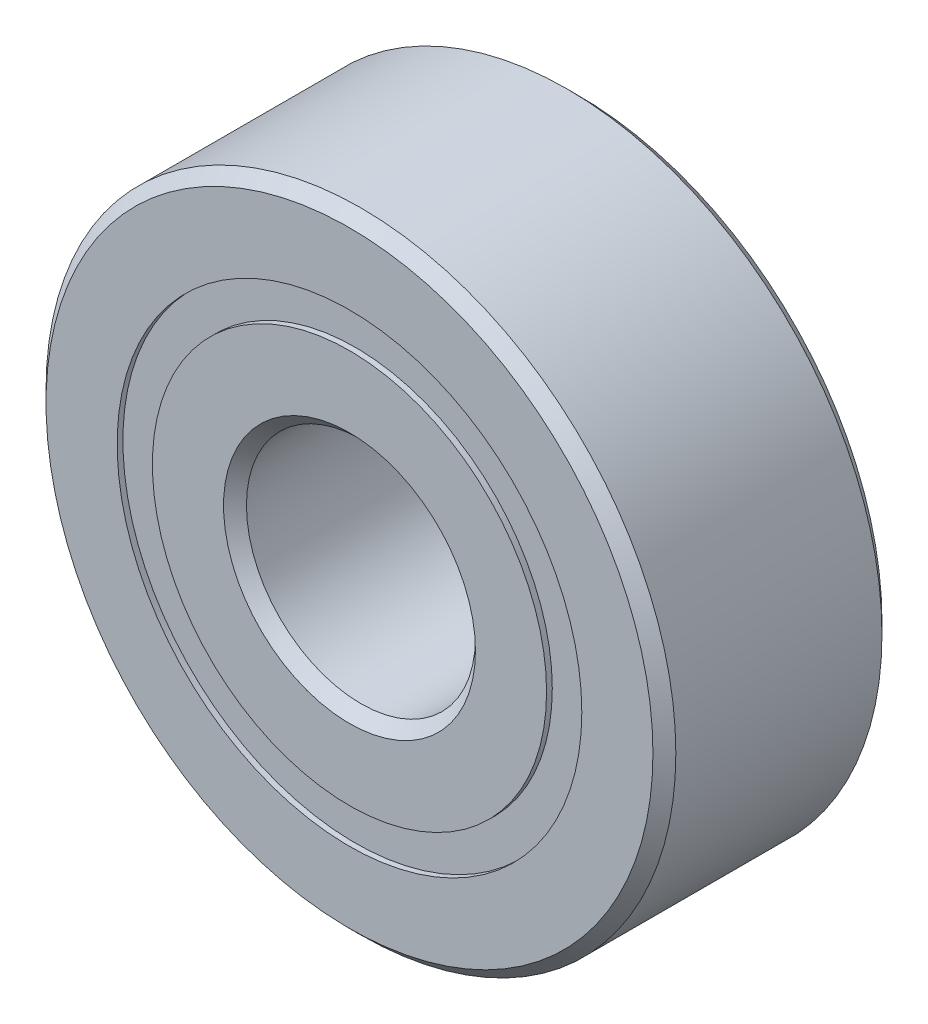
ISO-10303-21;
HEADER;
FILE_DESCRIPTION(('STEP AP214'),'2;1');
FILE_NAME('part.step','',(''),(''),'','','');
FILE_SCHEMA(('AUTOMOTIVE_DESIGN { 1 0 10303 214 1 1 1 1 }'));
ENDSEC;
DATA;
#1=APPLICATION_CONTEXT('core data for automotive mechanical design processes');
#2=APPLICATION_PROTOCOL_DEFINITION('international standard','automotive_design',2000,#1);
#3=PRODUCT_CONTEXT('',#1,'mechanical');
#4=PRODUCT('Part','Part','',(#3));
#5=PRODUCT_RELATED_PRODUCT_CATEGORY('part','',(#4));
#6=PRODUCT_DEFINITION_FORMATION('','',#4);
#7=PRODUCT_DEFINITION_CONTEXT('part definition',#1,'design');
#8=PRODUCT_DEFINITION('design','',#6,#7);
#9=PRODUCT_DEFINITION_SHAPE('','',#8);
#10=(LENGTH_UNIT() NAMED_UNIT(*) SI_UNIT(.MILLI.,.METRE.));
#11=(NAMED_UNIT(*) PLANE_ANGLE_UNIT() SI_UNIT($,.RADIAN.));
#12=(NAMED_UNIT(*) SI_UNIT($,.STERADIAN.) SOLID_ANGLE_UNIT());
#13=UNCERTAINTY_MEASURE_WITH_UNIT(LENGTH_MEASURE(1.E-05),#10,'distance_accuracy_value','');
#14=(GEOMETRIC_REPRESENTATION_CONTEXT(3) GLOBAL_UNCERTAINTY_ASSIGNED_CONTEXT((#13)) GLOBAL_UNIT_ASSIGNED_CONTEXT((#10,
#11,#12)) REPRESENTATION_CONTEXT('',''));
#15=CARTESIAN_POINT('',(0.,0.,0.));
#16=DIRECTION('',(0.,0.,1.));
#17=DIRECTION('',(1.,0.,0.));
#18=AXIS2_PLACEMENT_3D('',#15,#16,#17);
#19=CARTESIAN_POINT('',(0.,4.05769230769231,-1.9));
#20=DIRECTION('',(0.,0.,1.));
#21=DIRECTION('',(1.,0.,0.));
#22=AXIS2_PLACEMENT_3D('',#19,#20,#21);
#23=PLANE('',#22);
#24=CARTESIAN_POINT('',(0.,0.,-1.9));
#25=DIRECTION('',(0.,0.,1.));
#26=DIRECTION('',(1.,0.,0.));
#27=AXIS2_PLACEMENT_3D('',#24,#25,#26);
#28=CIRCLE('',#27,4.05769230769231);
#29=CARTESIAN_POINT('',(4.05769230769231,0.,-1.9));
#30=VERTEX_POINT('',#29);
#31=EDGE_CURVE('E64',#30,#30,#28,.T.);
#32=ORIENTED_EDGE('',*,*,#31,.F.);
#33=EDGE_LOOP('',(#32));
#34=FACE_BOUND('',#33,.T.);
#35=CARTESIAN_POINT('',(0.,0.,-1.9));
#36=DIRECTION('',(0.,0.,1.));
#37=DIRECTION('',(1.,0.,0.));
#38=AXIS2_PLACEMENT_3D('',#35,#36,#37);
#39=CIRCLE('',#38,3.44230769230769);
#40=CARTESIAN_POINT('',(3.44230769230769,0.,-1.9));
#41=VERTEX_POINT('',#40);
#42=EDGE_CURVE('E11',#41,#41,#39,.T.);
#43=ORIENTED_EDGE('',*,*,#42,.T.);
#44=EDGE_LOOP('',(#43));
#45=FACE_BOUND('',#44,.T.);
#46=ADVANCED_FACE('F50',(#34,#45),#23,.F.);
#47=CARTESIAN_POINT('',(0.,0.,2.));
#48=DIRECTION('',(0.,0.,1.));
#49=DIRECTION('',(1.,0.,0.));
#50=AXIS2_PLACEMENT_3D('',#47,#48,#49);
#51=CYLINDRICAL_SURFACE('',#50,3.44230769230769);
#52=ORIENTED_EDGE('',*,*,#42,.F.);
#53=EDGE_LOOP('',(#52));
#54=FACE_BOUND('',#53,.T.);
#55=CARTESIAN_POINT('',(0.,0.,-0.940637025107528));
#56=DIRECTION('',(0.,0.,1.));
#57=DIRECTION('',(1.,0.,0.));
#58=AXIS2_PLACEMENT_3D('',#55,#56,#57);
#59=CIRCLE('',#58,3.44230769230769);
#60=CARTESIAN_POINT('',(3.44230769230769,0.,-0.940637025107528));
#61=VERTEX_POINT('',#60);
#62=EDGE_CURVE('E56',#61,#61,#59,.T.);
#63=ORIENTED_EDGE('',*,*,#62,.T.);
#64=EDGE_LOOP('',(#63));
#65=FACE_BOUND('',#64,.T.);
#66=ADVANCED_FACE('F73',(#54,#65),#51,.F.);
#67=CARTESIAN_POINT('',(0.,4.05769230769231,-0.940637025107528));
#68=DIRECTION('',(0.,0.,-1.));
#69=DIRECTION('',(-1.,0.,0.));
#70=AXIS2_PLACEMENT_3D('',#67,#68,#69);
#71=PLANE('',#70);
#72=ORIENTED_EDGE('',*,*,#62,.F.);
#73=EDGE_LOOP('',(#72));
#74=FACE_BOUND('',#73,.T.);
#75=CARTESIAN_POINT('',(0.,0.,-0.940637025107528));
#76=DIRECTION('',(0.,0.,1.));
#77=DIRECTION('',(1.,0.,0.));
#78=AXIS2_PLACEMENT_3D('',#75,#76,#77);
#79=CIRCLE('',#78,4.05769230769231);
#80=CARTESIAN_POINT('',(4.05769230769231,0.,-0.940637025107528));
#81=VERTEX_POINT('',#80);
#82=EDGE_CURVE('E60',#81,#81,#79,.T.);
#83=ORIENTED_EDGE('',*,*,#82,.T.);
#84=EDGE_LOOP('',(#83));
#85=FACE_BOUND('',#84,.T.);
#86=ADVANCED_FACE('F77',(#74,#85),#71,.F.);
#87=CARTESIAN_POINT('',(0.,0.,2.));
#88=DIRECTION('',(0.,0.,1.));
#89=DIRECTION('',(1.,0.,0.));
#90=AXIS2_PLACEMENT_3D('',#87,#88,#89);
#91=CYLINDRICAL_SURFACE('',#90,4.05769230769231);
#92=ORIENTED_EDGE('',*,*,#82,.F.);
#93=EDGE_LOOP('',(#92));
#94=FACE_BOUND('',#93,.T.);
#95=ORIENTED_EDGE('',*,*,#31,.T.);
#96=EDGE_LOOP('',(#95));
#97=FACE_BOUND('',#96,.T.);
#98=ADVANCED_FACE('F70',(#94,#97),#91,.T.);
#99=CLOSED_SHELL('',(#46,#66,#86,#98));
#100=MANIFOLD_SOLID_BREP('B2',#99);
#101=CARTESIAN_POINT('',(0.,4.05769230769231,1.9));
#102=DIRECTION('',(0.,0.,-1.));
#103=DIRECTION('',(-1.,0.,0.));
#104=AXIS2_PLACEMENT_3D('',#101,#102,#103);
#105=PLANE('',#104);
#106=CARTESIAN_POINT('',(0.,0.,1.9));
#107=DIRECTION('',(0.,0.,1.));
#108=DIRECTION('',(1.,0.,0.));
#109=AXIS2_PLACEMENT_3D('',#106,#107,#108);
#110=CIRCLE('',#109,3.44230769230769);
#111=CARTESIAN_POINT('',(3.44230769230769,0.,1.9));
#112=VERTEX_POINT('',#111);
#113=EDGE_CURVE('E49',#112,#112,#110,.T.);
#114=ORIENTED_EDGE('',*,*,#113,.F.);
#115=EDGE_LOOP('',(#114));
#116=FACE_BOUND('',#115,.T.);
#117=CARTESIAN_POINT('',(0.,0.,1.9));
#118=DIRECTION('',(0.,0.,1.));
#119=DIRECTION('',(1.,0.,0.));
#120=AXIS2_PLACEMENT_3D('',#117,#118,#119);
#121=CIRCLE('',#120,4.05769230769231);
#122=CARTESIAN_POINT('',(4.05769230769231,0.,1.9));
#123=VERTEX_POINT('',#122);
#124=EDGE_CURVE('E124',#123,#123,#121,.T.);
#125=ORIENTED_EDGE('',*,*,#124,.T.);
#126=EDGE_LOOP('',(#125));
#127=FACE_BOUND('',#126,.T.);
#128=ADVANCED_FACE('F110',(#116,#127),#105,.F.);
#129=CARTESIAN_POINT('',(0.,0.,2.));
#130=DIRECTION('',(0.,0.,1.));
#131=DIRECTION('',(1.,0.,0.));
#132=AXIS2_PLACEMENT_3D('',#129,#130,#131);
#133=CYLINDRICAL_SURFACE('',#132,3.44230769230769);
#134=CARTESIAN_POINT('',(0.,0.,0.940637025107528));
#135=DIRECTION('',(0.,0.,1.));
#136=DIRECTION('',(1.,0.,0.));
#137=AXIS2_PLACEMENT_3D('',#134,#135,#136);
#138=CIRCLE('',#137,3.44230769230769);
#139=CARTESIAN_POINT('',(3.44230769230769,0.,0.940637025107528));
#140=VERTEX_POINT('',#139);
#141=EDGE_CURVE('E116',#140,#140,#138,.T.);
#142=ORIENTED_EDGE('',*,*,#141,.F.);
#143=EDGE_LOOP('',(#142));
#144=FACE_BOUND('',#143,.T.);
#145=ORIENTED_EDGE('',*,*,#113,.T.);
#146=EDGE_LOOP('',(#145));
#147=FACE_BOUND('',#146,.T.);
#148=ADVANCED_FACE('F139',(#144,#147),#133,.F.);
#149=CARTESIAN_POINT('',(0.,4.05769230769231,0.940637025107528));
#150=DIRECTION('',(0.,0.,1.));
#151=DIRECTION('',(1.,0.,0.));
#152=AXIS2_PLACEMENT_3D('',#149,#150,#151);
#153=PLANE('',#152);
#154=CARTESIAN_POINT('',(0.,0.,0.940637025107528));
#155=DIRECTION('',(0.,0.,1.));
#156=DIRECTION('',(1.,0.,0.));
#157=AXIS2_PLACEMENT_3D('',#154,#155,#156);
#158=CIRCLE('',#157,4.05769230769231);
#159=CARTESIAN_POINT('',(4.05769230769231,0.,0.940637025107528));
#160=VERTEX_POINT('',#159);
#161=EDGE_CURVE('E120',#160,#160,#158,.T.);
#162=ORIENTED_EDGE('',*,*,#161,.F.);
#163=EDGE_LOOP('',(#162));
#164=FACE_BOUND('',#163,.T.);
#165=ORIENTED_EDGE('',*,*,#141,.T.);
#166=EDGE_LOOP('',(#165));
#167=FACE_BOUND('',#166,.T.);
#168=ADVANCED_FACE('F134',(#164,#167),#153,.F.);
#169=CARTESIAN_POINT('',(0.,0.,2.));
#170=DIRECTION('',(0.,0.,1.));
#171=DIRECTION('',(1.,0.,0.));
#172=AXIS2_PLACEMENT_3D('',#169,#170,#171);
#173=CYLINDRICAL_SURFACE('',#172,4.05769230769231);
#174=ORIENTED_EDGE('',*,*,#124,.F.);
#175=EDGE_LOOP('',(#174));
#176=FACE_BOUND('',#175,.T.);
#177=ORIENTED_EDGE('',*,*,#161,.T.);
#178=EDGE_LOOP('',(#177));
#179=FACE_BOUND('',#178,.T.);
#180=ADVANCED_FACE('F131',(#176,#179),#173,.T.);
#181=CLOSED_SHELL('',(#128,#148,#168,#180));
#182=MANIFOLD_SOLID_BREP('B6',#181);
#183=CARTESIAN_POINT('',(-1.87499999999996,3.24759526419167,0.));
#184=DIRECTION('',(0.,0.,1.));
#185=DIRECTION('',(-0.499999999999989,0.866025403784445,0.));
#186=AXIS2_PLACEMENT_3D('',#183,#184,#185);
#187=SPHERICAL_SURFACE('',#186,0.940637025107528);
#188=CARTESIAN_POINT('',(-1.87499999999996,3.24759526419167,0.940637025107528));
#189=VERTEX_POINT('',#188);
#190=VERTEX_LOOP('',#189);
#191=FACE_BOUND('',#190,.T.);
#192=ADVANCED_FACE('F170',(#191),#187,.T.);
#193=CLOSED_SHELL('',(#192));
#194=MANIFOLD_SOLID_BREP('B44',#193);
#195=CARTESIAN_POINT('',(-3.24759526419162,1.87500000000004,0.));
#196=DIRECTION('',(0.,0.,1.));
#197=DIRECTION('',(-0.866025403784433,0.50000000000001,0.));
#198=AXIS2_PLACEMENT_3D('',#195,#196,#197);
#199=SPHERICAL_SURFACE('',#198,0.940637025107528);
#200=CARTESIAN_POINT('',(-3.24759526419162,1.87500000000004,0.940637025107528));
#201=VERTEX_POINT('',#200);
#202=VERTEX_LOOP('',#201);
#203=FACE_BOUND('',#202,.T.);
#204=ADVANCED_FACE('F193',(#203),#199,.T.);
#205=CLOSED_SHELL('',(#204));
#206=MANIFOLD_SOLID_BREP('B106',#205);
#207=CARTESIAN_POINT('',(-3.75,0.,0.));
#208=DIRECTION('',(0.,0.,1.));
#209=DIRECTION('',(-1.,0.,0.));
#210=AXIS2_PLACEMENT_3D('',#207,#208,#209);
#211=SPHERICAL_SURFACE('',#210,0.940637025107528);
#212=CARTESIAN_POINT('',(-3.75,0.,0.940637025107528));
#213=VERTEX_POINT('',#212);
#214=VERTEX_LOOP('',#213);
#215=FACE_BOUND('',#214,.T.);
#216=ADVANCED_FACE('F216',(#215),#211,.T.);
#217=CLOSED_SHELL('',(#216));
#218=MANIFOLD_SOLID_BREP('B166',#217);
#219=CARTESIAN_POINT('',(-3.24759526419166,-1.87499999999997,0.));
#220=DIRECTION('',(0.,0.,1.));
#221=DIRECTION('',(-0.866025403784443,-0.499999999999992,0.));
#222=AXIS2_PLACEMENT_3D('',#219,#220,#221);
#223=SPHERICAL_SURFACE('',#222,0.940637025107528);
#224=CARTESIAN_POINT('',(-3.24759526419166,-1.87499999999997,0.940637025107528));
#225=VERTEX_POINT('',#224);
#226=VERTEX_LOOP('',#225);
#227=FACE_BOUND('',#226,.T.);
#228=ADVANCED_FACE('F239',(#227),#223,.T.);
#229=CLOSED_SHELL('',(#228));
#230=MANIFOLD_SOLID_BREP('B189',#229);
#231=CARTESIAN_POINT('',(-1.87500000000003,-3.24759526419163,0.));
#232=DIRECTION('',(0.,0.,1.));
#233=DIRECTION('',(-0.500000000000007,-0.866025403784435,0.));
#234=AXIS2_PLACEMENT_3D('',#231,#232,#233);
#235=SPHERICAL_SURFACE('',#234,0.940637025107528);
#236=CARTESIAN_POINT('',(-1.87500000000003,-3.24759526419163,0.940637025107528));
#237=VERTEX_POINT('',#236);
#238=VERTEX_LOOP('',#237);
#239=FACE_BOUND('',#238,.T.);
#240=ADVANCED_FACE('F262',(#239),#235,.T.);
#241=CLOSED_SHELL('',(#240));
#242=MANIFOLD_SOLID_BREP('B212',#241);
#243=CARTESIAN_POINT('',(0.,-3.75,0.));
#244=DIRECTION('',(0.,0.,1.));
#245=DIRECTION('',(0.,-1.,0.));
#246=AXIS2_PLACEMENT_3D('',#243,#244,#245);
#247=SPHERICAL_SURFACE('',#246,0.940637025107528);
#248=CARTESIAN_POINT('',(0.,-3.75,0.940637025107528));
#249=VERTEX_POINT('',#248);
#250=VERTEX_LOOP('',#249);
#251=FACE_BOUND('',#250,.T.);
#252=ADVANCED_FACE('F285',(#251),#247,.T.);
#253=CLOSED_SHELL('',(#252));
#254=MANIFOLD_SOLID_BREP('B235',#253);
#255=CARTESIAN_POINT('',(1.87499999999998,-3.24759526419166,0.));
#256=DIRECTION('',(0.,0.,1.));
#257=DIRECTION('',(0.499999999999995,-0.866025403784442,0.));
#258=AXIS2_PLACEMENT_3D('',#255,#256,#257);
#259=SPHERICAL_SURFACE('',#258,0.940637025107528);
#260=CARTESIAN_POINT('',(1.87499999999998,-3.24759526419166,0.940637025107528));
#261=VERTEX_POINT('',#260);
#262=VERTEX_LOOP('',#261);
#263=FACE_BOUND('',#262,.T.);
#264=ADVANCED_FACE('F308',(#263),#259,.T.);
#265=CLOSED_SHELL('',(#264));
#266=MANIFOLD_SOLID_BREP('B258',#265);
#267=CARTESIAN_POINT('',(3.24759526419164,-1.87500000000002,0.));
#268=DIRECTION('',(0.,0.,1.));
#269=DIRECTION('',(0.866025403784436,-0.500000000000004,0.));
#270=AXIS2_PLACEMENT_3D('',#267,#268,#269);
#271=SPHERICAL_SURFACE('',#270,0.940637025107528);
#272=CARTESIAN_POINT('',(3.24759526419164,-1.87500000000002,0.940637025107528));
#273=VERTEX_POINT('',#272);
#274=VERTEX_LOOP('',#273);
#275=FACE_BOUND('',#274,.T.);
#276=ADVANCED_FACE('F331',(#275),#271,.T.);
#277=CLOSED_SHELL('',(#276));
#278=MANIFOLD_SOLID_BREP('B281',#277);
#279=CARTESIAN_POINT('',(3.75,0.,0.));
#280=DIRECTION('',(0.,0.,1.));
#281=DIRECTION('',(1.,0.,0.));
#282=AXIS2_PLACEMENT_3D('',#279,#280,#281);
#283=SPHERICAL_SURFACE('',#282,0.940637025107528);
#284=CARTESIAN_POINT('',(3.75,0.,0.940637025107528));
#285=VERTEX_POINT('',#284);
#286=VERTEX_LOOP('',#285);
#287=FACE_BOUND('',#286,.T.);
#288=ADVANCED_FACE('F354',(#287),#283,.T.);
#289=CLOSED_SHELL('',(#288));
#290=MANIFOLD_SOLID_BREP('B304',#289);
#291=CARTESIAN_POINT('',(3.24759526419165,1.87499999999999,0.));
#292=DIRECTION('',(0.,0.,1.));
#293=DIRECTION('',(0.86602540378444,0.499999999999998,0.));
#294=AXIS2_PLACEMENT_3D('',#291,#292,#293);
#295=SPHERICAL_SURFACE('',#294,0.940637025107528);
#296=CARTESIAN_POINT('',(3.24759526419165,1.87499999999999,0.940637025107528));
#297=VERTEX_POINT('',#296);
#298=VERTEX_LOOP('',#297);
#299=FACE_BOUND('',#298,.T.);
#300=ADVANCED_FACE('F377',(#299),#295,.T.);
#301=CLOSED_SHELL('',(#300));
#302=MANIFOLD_SOLID_BREP('B327',#301);
#303=CARTESIAN_POINT('',(1.875,3.24759526419164,0.));
#304=DIRECTION('',(0.,0.,1.));
#305=DIRECTION('',(0.500000000000001,0.866025403784438,0.));
#306=AXIS2_PLACEMENT_3D('',#303,#304,#305);
#307=SPHERICAL_SURFACE('',#306,0.940637025107528);
#308=CARTESIAN_POINT('',(1.875,3.24759526419164,0.940637025107528));
#309=VERTEX_POINT('',#308);
#310=VERTEX_LOOP('',#309);
#311=FACE_BOUND('',#310,.T.);
#312=ADVANCED_FACE('F400',(#311),#307,.T.);
#313=CLOSED_SHELL('',(#312));
#314=MANIFOLD_SOLID_BREP('B350',#313);
#315=CARTESIAN_POINT('',(0.,3.75,0.));
#316=DIRECTION('',(0.,0.,1.));
#317=DIRECTION('',(0.,1.,0.));
#318=AXIS2_PLACEMENT_3D('',#315,#316,#317);
#319=SPHERICAL_SURFACE('',#318,0.940637025107528);
#320=CARTESIAN_POINT('',(0.,3.75,0.940637025107528));
#321=VERTEX_POINT('',#320);
#322=VERTEX_LOOP('',#321);
#323=FACE_BOUND('',#322,.T.);
#324=ADVANCED_FACE('F425',(#323),#319,.T.);
#325=CLOSED_SHELL('',(#324));
#326=MANIFOLD_SOLID_BREP('B373',#325);
#327=CARTESIAN_POINT('',(0.,3.44230769230769,2.));
#328=DIRECTION('',(0.,0.,-1.));
#329=DIRECTION('',(-1.,0.,0.));
#330=AXIS2_PLACEMENT_3D('',#327,#328,#329);
#331=PLANE('',#330);
#332=CARTESIAN_POINT('',(0.,0.,2.));
#333=DIRECTION('',(0.,0.,1.));
#334=DIRECTION('',(1.,0.,0.));
#335=AXIS2_PLACEMENT_3D('',#332,#333,#334);
#336=CIRCLE('',#335,2.2);
#337=CARTESIAN_POINT('',(2.2,0.,2.));
#338=VERTEX_POINT('',#337);
#339=EDGE_CURVE('E471',#338,#338,#336,.T.);
#340=ORIENTED_EDGE('',*,*,#339,.F.);
#341=EDGE_LOOP('',(#340));
#342=FACE_BOUND('',#341,.T.);
#343=CARTESIAN_POINT('',(0.,0.,2.));
#344=DIRECTION('',(0.,0.,1.));
#345=DIRECTION('',(1.,0.,0.));
#346=AXIS2_PLACEMENT_3D('',#343,#344,#345);
#347=CIRCLE('',#346,3.44230769230769);
#348=CARTESIAN_POINT('',(3.44230769230769,0.,2.));
#349=VERTEX_POINT('',#348);
#350=EDGE_CURVE('E424',#349,#349,#347,.T.);
#351=ORIENTED_EDGE('',*,*,#350,.T.);
#352=EDGE_LOOP('',(#351));
#353=FACE_BOUND('',#352,.T.);
#354=ADVANCED_FACE('F443',(#342,#353),#331,.F.);
#355=CARTESIAN_POINT('',(0.,0.,2.));
#356=DIRECTION('',(0.,0.,1.));
#357=DIRECTION('',(1.,0.,0.));
#358=AXIS2_PLACEMENT_3D('',#355,#356,#357);
#359=CYLINDRICAL_SURFACE('',#358,3.44230769230769);
#360=ORIENTED_EDGE('',*,*,#350,.F.);
#361=EDGE_LOOP('',(#360));
#362=FACE_BOUND('',#361,.T.);
#363=CARTESIAN_POINT('',(0.,0.,0.888888888888889));
#364=DIRECTION('',(0.,0.,1.));
#365=DIRECTION('',(1.,0.,0.));
#366=AXIS2_PLACEMENT_3D('',#363,#364,#365);
#367=CIRCLE('',#366,3.44230769230769);
#368=CARTESIAN_POINT('',(3.44230769230769,0.,0.888888888888889));
#369=VERTEX_POINT('',#368);
#370=EDGE_CURVE('E449',#369,#369,#367,.T.);
#371=ORIENTED_EDGE('',*,*,#370,.T.);
#372=EDGE_LOOP('',(#371));
#373=FACE_BOUND('',#372,.T.);
#374=ADVANCED_FACE('F478',(#362,#373),#359,.T.);
#375=CARTESIAN_POINT('',(0.,0.,0.));
#376=DIRECTION('',(0.,0.,1.));
#377=DIRECTION('',(1.,0.,0.));
#378=AXIS2_PLACEMENT_3D('',#375,#376,#377);
#379=TOROIDAL_SURFACE('',#378,3.75,0.940637025107527);
#380=ORIENTED_EDGE('',*,*,#370,.F.);
#381=EDGE_LOOP('',(#380));
#382=FACE_BOUND('',#381,.T.);
#383=CARTESIAN_POINT('',(0.,0.,-0.88888888888889));
#384=DIRECTION('',(0.,0.,1.));
#385=DIRECTION('',(1.,0.,0.));
#386=AXIS2_PLACEMENT_3D('',#383,#384,#385);
#387=CIRCLE('',#386,3.44230769230769);
#388=CARTESIAN_POINT('',(3.44230769230769,0.,-0.88888888888889));
#389=VERTEX_POINT('',#388);
#390=EDGE_CURVE('E453',#389,#389,#387,.T.);
#391=ORIENTED_EDGE('',*,*,#390,.T.);
#392=EDGE_LOOP('',(#391));
#393=FACE_BOUND('',#392,.T.);
#394=ADVANCED_FACE('F482',(#382,#393),#379,.F.);
#395=CARTESIAN_POINT('',(0.,0.,2.));
#396=DIRECTION('',(0.,0.,1.));
#397=DIRECTION('',(1.,0.,0.));
#398=AXIS2_PLACEMENT_3D('',#395,#396,#397);
#399=CYLINDRICAL_SURFACE('',#398,3.44230769230769);
#400=ORIENTED_EDGE('',*,*,#390,.F.);
#401=EDGE_LOOP('',(#400));
#402=FACE_BOUND('',#401,.T.);
#403=CARTESIAN_POINT('',(0.,0.,-2.));
#404=DIRECTION('',(0.,0.,1.));
#405=DIRECTION('',(1.,0.,0.));
#406=AXIS2_PLACEMENT_3D('',#403,#404,#405);
#407=CIRCLE('',#406,3.44230769230769);
#408=CARTESIAN_POINT('',(3.44230769230769,0.,-2.));
#409=VERTEX_POINT('',#408);
#410=EDGE_CURVE('E457',#409,#409,#407,.T.);
#411=ORIENTED_EDGE('',*,*,#410,.T.);
#412=EDGE_LOOP('',(#411));
#413=FACE_BOUND('',#412,.T.);
#414=ADVANCED_FACE('F487',(#402,#413),#399,.T.);
#415=CARTESIAN_POINT('',(0.,2.2,-2.));
#416=DIRECTION('',(0.,0.,1.));
#417=DIRECTION('',(1.,0.,0.));
#418=AXIS2_PLACEMENT_3D('',#415,#416,#417);
#419=PLANE('',#418);
#420=ORIENTED_EDGE('',*,*,#410,.F.);
#421=EDGE_LOOP('',(#420));
#422=FACE_BOUND('',#421,.T.);
#423=CARTESIAN_POINT('',(0.,0.,-2.));
#424=DIRECTION('',(0.,0.,1.));
#425=DIRECTION('',(1.,0.,0.));
#426=AXIS2_PLACEMENT_3D('',#423,#424,#425);
#427=CIRCLE('',#426,2.2);
#428=CARTESIAN_POINT('',(2.2,0.,-2.));
#429=VERTEX_POINT('',#428);
#430=EDGE_CURVE('E462',#429,#429,#427,.T.);
#431=ORIENTED_EDGE('',*,*,#430,.T.);
#432=EDGE_LOOP('',(#431));
#433=FACE_BOUND('',#432,.T.);
#434=ADVANCED_FACE('F493',(#422,#433),#419,.F.);
#435=CARTESIAN_POINT('',(0.,0.,-1.8));
#436=DIRECTION('',(0.,0.,-1.));
#437=DIRECTION('',(-1.,0.,0.));
#438=AXIS2_PLACEMENT_3D('',#435,#436,#437);
#439=CONICAL_SURFACE('',#438,2.,0.785398163397454);
#440=ORIENTED_EDGE('',*,*,#430,.F.);
#441=EDGE_LOOP('',(#440));
#442=FACE_BOUND('',#441,.T.);
#443=CARTESIAN_POINT('',(0.,0.,-1.8));
#444=DIRECTION('',(0.,0.,1.));
#445=DIRECTION('',(1.,0.,0.));
#446=AXIS2_PLACEMENT_3D('',#443,#444,#445);
#447=CIRCLE('',#446,2.);
#448=CARTESIAN_POINT('',(2.,0.,-1.8));
#449=VERTEX_POINT('',#448);
#450=EDGE_CURVE('E465',#449,#449,#447,.T.);
#451=ORIENTED_EDGE('',*,*,#450,.T.);
#452=EDGE_LOOP('',(#451));
#453=FACE_BOUND('',#452,.T.);
#454=ADVANCED_FACE('F497',(#442,#453),#439,.F.);
#455=CARTESIAN_POINT('',(0.,0.,2.));
#456=DIRECTION('',(0.,0.,1.));
#457=DIRECTION('',(1.,0.,0.));
#458=AXIS2_PLACEMENT_3D('',#455,#456,#457);
#459=CYLINDRICAL_SURFACE('',#458,2.);
#460=ORIENTED_EDGE('',*,*,#450,.F.);
#461=EDGE_LOOP('',(#460));
#462=FACE_BOUND('',#461,.T.);
#463=CARTESIAN_POINT('',(0.,0.,1.8));
#464=DIRECTION('',(0.,0.,1.));
#465=DIRECTION('',(1.,0.,0.));
#466=AXIS2_PLACEMENT_3D('',#463,#464,#465);
#467=CIRCLE('',#466,2.);
#468=CARTESIAN_POINT('',(2.,0.,1.8));
#469=VERTEX_POINT('',#468);
#470=EDGE_CURVE('E468',#469,#469,#467,.T.);
#471=ORIENTED_EDGE('',*,*,#470,.T.);
#472=EDGE_LOOP('',(#471));
#473=FACE_BOUND('',#472,.T.);
#474=ADVANCED_FACE('F501',(#462,#473),#459,.F.);
#475=CARTESIAN_POINT('',(0.,0.,2.));
#476=DIRECTION('',(0.,0.,1.));
#477=DIRECTION('',(1.,0.,0.));
#478=AXIS2_PLACEMENT_3D('',#475,#476,#477);
#479=CONICAL_SURFACE('',#478,2.2,0.785398163397443);
#480=ORIENTED_EDGE('',*,*,#470,.F.);
#481=EDGE_LOOP('',(#480));
#482=FACE_BOUND('',#481,.T.);
#483=ORIENTED_EDGE('',*,*,#339,.T.);
#484=EDGE_LOOP('',(#483));
#485=FACE_BOUND('',#484,.T.);
#486=ADVANCED_FACE('F475',(#482,#485),#479,.F.);
#487=CLOSED_SHELL('',(#354,#374,#394,#414,#434,#454,#474,#486));
#488=MANIFOLD_SOLID_BREP('B396',#487);
#489=CARTESIAN_POINT('',(0.,0.,1.8));
#490=DIRECTION('',(0.,0.,-1.));
#491=DIRECTION('',(-1.,0.,0.));
#492=AXIS2_PLACEMENT_3D('',#489,#490,#491);
#493=CONICAL_SURFACE('',#492,5.5,0.785398163397449);
#494=CARTESIAN_POINT('',(0.,0.,2.));
#495=DIRECTION('',(0.,0.,1.));
#496=DIRECTION('',(1.,0.,0.));
#497=AXIS2_PLACEMENT_3D('',#494,#495,#496);
#498=CIRCLE('',#497,5.3);
#499=CARTESIAN_POINT('',(5.3,0.,2.));
#500=VERTEX_POINT('',#499);
#501=EDGE_CURVE('E577',#500,#500,#498,.T.);
#502=ORIENTED_EDGE('',*,*,#501,.F.);
#503=EDGE_LOOP('',(#502));
#504=FACE_BOUND('',#503,.T.);
#505=CARTESIAN_POINT('',(0.,0.,1.8));
#506=DIRECTION('',(0.,0.,1.));
#507=DIRECTION('',(1.,0.,0.));
#508=AXIS2_PLACEMENT_3D('',#505,#506,#507);
#509=CIRCLE('',#508,5.5);
#510=CARTESIAN_POINT('',(5.5,0.,1.8));
#511=VERTEX_POINT('',#510);
#512=EDGE_CURVE('E442',#511,#511,#509,.T.);
#513=ORIENTED_EDGE('',*,*,#512,.T.);
#514=EDGE_LOOP('',(#513));
#515=FACE_BOUND('',#514,.T.);
#516=ADVANCED_FACE('F549',(#504,#515),#493,.T.);
#517=CARTESIAN_POINT('',(0.,0.,2.));
#518=DIRECTION('',(0.,0.,1.));
#519=DIRECTION('',(1.,0.,0.));
#520=AXIS2_PLACEMENT_3D('',#517,#518,#519);
#521=CYLINDRICAL_SURFACE('',#520,5.5);
#522=ORIENTED_EDGE('',*,*,#512,.F.);
#523=EDGE_LOOP('',(#522));
#524=FACE_BOUND('',#523,.T.);
#525=CARTESIAN_POINT('',(0.,0.,-1.8));
#526=DIRECTION('',(0.,0.,1.));
#527=DIRECTION('',(1.,0.,0.));
#528=AXIS2_PLACEMENT_3D('',#525,#526,#527);
#529=CIRCLE('',#528,5.5);
#530=CARTESIAN_POINT('',(5.5,0.,-1.8));
#531=VERTEX_POINT('',#530);
#532=EDGE_CURVE('E555',#531,#531,#529,.T.);
#533=ORIENTED_EDGE('',*,*,#532,.T.);
#534=EDGE_LOOP('',(#533));
#535=FACE_BOUND('',#534,.T.);
#536=ADVANCED_FACE('F584',(#524,#535),#521,.T.);
#537=CARTESIAN_POINT('',(0.,0.,-2.));
#538=DIRECTION('',(0.,0.,1.));
#539=DIRECTION('',(1.,0.,0.));
#540=AXIS2_PLACEMENT_3D('',#537,#538,#539);
#541=CONICAL_SURFACE('',#540,5.3,0.78539816339745);
#542=ORIENTED_EDGE('',*,*,#532,.F.);
#543=EDGE_LOOP('',(#542));
#544=FACE_BOUND('',#543,.T.);
#545=CARTESIAN_POINT('',(0.,0.,-2.));
#546=DIRECTION('',(0.,0.,1.));
#547=DIRECTION('',(1.,0.,0.));
#548=AXIS2_PLACEMENT_3D('',#545,#546,#547);
#549=CIRCLE('',#548,5.3);
#550=CARTESIAN_POINT('',(5.3,0.,-2.));
#551=VERTEX_POINT('',#550);
#552=EDGE_CURVE('E559',#551,#551,#549,.T.);
#553=ORIENTED_EDGE('',*,*,#552,.T.);
#554=EDGE_LOOP('',(#553));
#555=FACE_BOUND('',#554,.T.);
#556=ADVANCED_FACE('F588',(#544,#555),#541,.T.);
#557=CARTESIAN_POINT('',(0.,5.3,-2.));
#558=DIRECTION('',(0.,0.,1.));
#559=DIRECTION('',(1.,0.,0.));
#560=AXIS2_PLACEMENT_3D('',#557,#558,#559);
#561=PLANE('',#560);
#562=ORIENTED_EDGE('',*,*,#552,.F.);
#563=EDGE_LOOP('',(#562));
#564=FACE_BOUND('',#563,.T.);
#565=CARTESIAN_POINT('',(0.,0.,-2.));
#566=DIRECTION('',(0.,0.,1.));
#567=DIRECTION('',(1.,0.,0.));
#568=AXIS2_PLACEMENT_3D('',#565,#566,#567);
#569=CIRCLE('',#568,4.05769230769231);
#570=CARTESIAN_POINT('',(4.05769230769231,0.,-2.));
#571=VERTEX_POINT('',#570);
#572=EDGE_CURVE('E563',#571,#571,#569,.T.);
#573=ORIENTED_EDGE('',*,*,#572,.T.);
#574=EDGE_LOOP('',(#573));
#575=FACE_BOUND('',#574,.T.);
#576=ADVANCED_FACE('F593',(#564,#575),#561,.F.);
#577=CARTESIAN_POINT('',(0.,0.,2.));
#578=DIRECTION('',(0.,0.,1.));
#579=DIRECTION('',(1.,0.,0.));
#580=AXIS2_PLACEMENT_3D('',#577,#578,#579);
#581=CYLINDRICAL_SURFACE('',#580,4.05769230769231);
#582=ORIENTED_EDGE('',*,*,#572,.F.);
#583=EDGE_LOOP('',(#582));
#584=FACE_BOUND('',#583,.T.);
#585=CARTESIAN_POINT('',(0.,0.,-0.888888888888889));
#586=DIRECTION('',(0.,0.,1.));
#587=DIRECTION('',(1.,0.,0.));
#588=AXIS2_PLACEMENT_3D('',#585,#586,#587);
#589=CIRCLE('',#588,4.05769230769231);
#590=CARTESIAN_POINT('',(4.05769230769231,0.,-0.888888888888889));
#591=VERTEX_POINT('',#590);
#592=EDGE_CURVE('E568',#591,#591,#589,.T.);
#593=ORIENTED_EDGE('',*,*,#592,.T.);
#594=EDGE_LOOP('',(#593));
#595=FACE_BOUND('',#594,.T.);
#596=ADVANCED_FACE('F599',(#584,#595),#581,.F.);
#597=CARTESIAN_POINT('',(0.,0.,0.));
#598=DIRECTION('',(0.,0.,1.));
#599=DIRECTION('',(1.,0.,0.));
#600=AXIS2_PLACEMENT_3D('',#597,#598,#599);
#601=TOROIDAL_SURFACE('',#600,3.75,0.940637025107528);
#602=ORIENTED_EDGE('',*,*,#592,.F.);
#603=EDGE_LOOP('',(#602));
#604=FACE_BOUND('',#603,.T.);
#605=CARTESIAN_POINT('',(0.,0.,0.888888888888889));
#606=DIRECTION('',(0.,0.,1.));
#607=DIRECTION('',(1.,0.,0.));
#608=AXIS2_PLACEMENT_3D('',#605,#606,#607);
#609=CIRCLE('',#608,4.05769230769231);
#610=CARTESIAN_POINT('',(4.05769230769231,0.,0.888888888888889));
#611=VERTEX_POINT('',#610);
#612=EDGE_CURVE('E571',#611,#611,#609,.T.);
#613=ORIENTED_EDGE('',*,*,#612,.T.);
#614=EDGE_LOOP('',(#613));
#615=FACE_BOUND('',#614,.T.);
#616=ADVANCED_FACE('F603',(#604,#615),#601,.F.);
#617=CARTESIAN_POINT('',(0.,0.,2.));
#618=DIRECTION('',(0.,0.,1.));
#619=DIRECTION('',(1.,0.,0.));
#620=AXIS2_PLACEMENT_3D('',#617,#618,#619);
#621=CYLINDRICAL_SURFACE('',#620,4.05769230769231);
#622=ORIENTED_EDGE('',*,*,#612,.F.);
#623=EDGE_LOOP('',(#622));
#624=FACE_BOUND('',#623,.T.);
#625=CARTESIAN_POINT('',(0.,0.,2.));
#626=DIRECTION('',(0.,0.,1.));
#627=DIRECTION('',(1.,0.,0.));
#628=AXIS2_PLACEMENT_3D('',#625,#626,#627);
#629=CIRCLE('',#628,4.05769230769231);
#630=CARTESIAN_POINT('',(4.05769230769231,0.,2.));
#631=VERTEX_POINT('',#630);
#632=EDGE_CURVE('E574',#631,#631,#629,.T.);
#633=ORIENTED_EDGE('',*,*,#632,.T.);
#634=EDGE_LOOP('',(#633));
#635=FACE_BOUND('',#634,.T.);
#636=ADVANCED_FACE('F607',(#624,#635),#621,.F.);
#637=CARTESIAN_POINT('',(0.,5.3,2.));
#638=DIRECTION('',(0.,0.,-1.));
#639=DIRECTION('',(-1.,0.,0.));
#640=AXIS2_PLACEMENT_3D('',#637,#638,#639);
#641=PLANE('',#640);
#642=ORIENTED_EDGE('',*,*,#632,.F.);
#643=EDGE_LOOP('',(#642));
#644=FACE_BOUND('',#643,.T.);
#645=ORIENTED_EDGE('',*,*,#501,.T.);
#646=EDGE_LOOP('',(#645));
#647=FACE_BOUND('',#646,.T.);
#648=ADVANCED_FACE('F581',(#644,#647),#641,.F.);
#649=CLOSED_SHELL('',(#516,#536,#556,#576,#596,#616,#636,#648));
#650=MANIFOLD_SOLID_BREP('B419',#649);
#651=ADVANCED_BREP_SHAPE_REPRESENTATION('',(#18,#100,#182,#194,#206,#218,#230,#242,#254,#266,
#278,#290,#302,#314,#326,#488,#650),#14);
#652=SHAPE_DEFINITION_REPRESENTATION(#9,#651);
ENDSEC;
END-ISO-10303-21;
